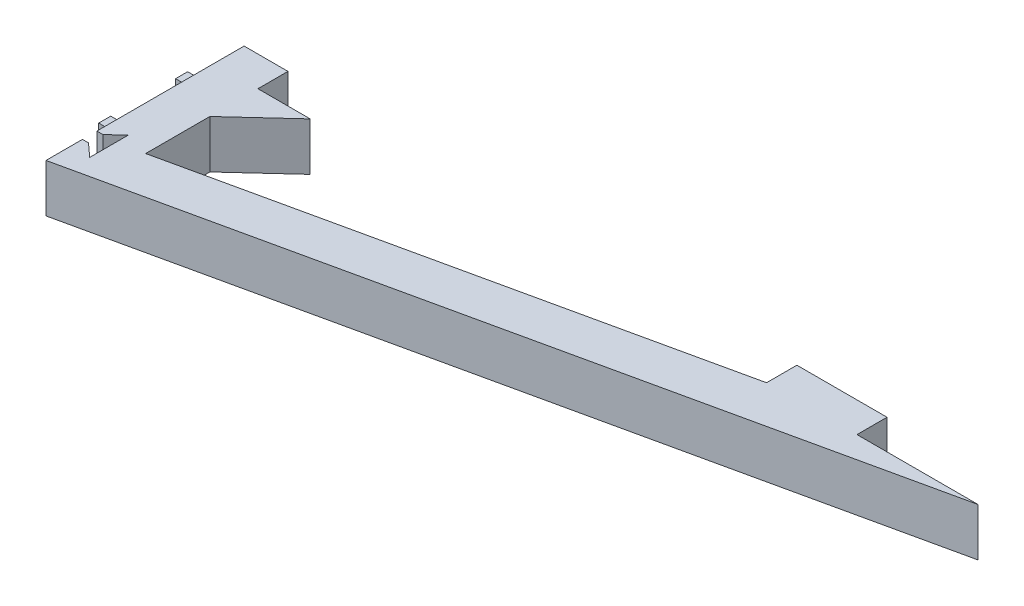
ISO-10303-21;
HEADER;
FILE_DESCRIPTION(('STEP AP214'),'2;1');
FILE_NAME('part.step','',(''),(''),'','','');
FILE_SCHEMA(('AUTOMOTIVE_DESIGN { 1 0 10303 214 1 1 1 1 }'));
ENDSEC;
DATA;
#1=APPLICATION_CONTEXT('core data for automotive mechanical design processes');
#2=APPLICATION_PROTOCOL_DEFINITION('international standard','automotive_design',2000,#1);
#3=PRODUCT_CONTEXT('',#1,'mechanical');
#4=PRODUCT('Part','Part','',(#3));
#5=PRODUCT_RELATED_PRODUCT_CATEGORY('part','',(#4));
#6=PRODUCT_DEFINITION_FORMATION('','',#4);
#7=PRODUCT_DEFINITION_CONTEXT('part definition',#1,'design');
#8=PRODUCT_DEFINITION('design','',#6,#7);
#9=PRODUCT_DEFINITION_SHAPE('','',#8);
#10=(LENGTH_UNIT() NAMED_UNIT(*) SI_UNIT(.MILLI.,.METRE.));
#11=(NAMED_UNIT(*) PLANE_ANGLE_UNIT() SI_UNIT($,.RADIAN.));
#12=(NAMED_UNIT(*) SI_UNIT($,.STERADIAN.) SOLID_ANGLE_UNIT());
#13=UNCERTAINTY_MEASURE_WITH_UNIT(LENGTH_MEASURE(1.E-05),#10,'distance_accuracy_value','');
#14=(GEOMETRIC_REPRESENTATION_CONTEXT(3) GLOBAL_UNCERTAINTY_ASSIGNED_CONTEXT((#13)) GLOBAL_UNIT_ASSIGNED_CONTEXT((#10,
#11,#12)) REPRESENTATION_CONTEXT('',''));
#15=CARTESIAN_POINT('',(0.,0.,0.));
#16=DIRECTION('',(0.,0.,1.));
#17=DIRECTION('',(1.,0.,0.));
#18=AXIS2_PLACEMENT_3D('',#15,#16,#17);
#19=CARTESIAN_POINT('',(7.3,8.,23.6847128039991));
#20=DIRECTION('',(-1.,0.,0.));
#21=DIRECTION('',(0.,0.,1.));
#22=AXIS2_PLACEMENT_3D('',#19,#20,#21);
#23=PLANE('',#22);
#24=DIRECTION('',(0.,0.,-1.));
#25=VECTOR('',#24,1.);
#26=CARTESIAN_POINT('',(7.3,8.,23.6847128039991));
#27=LINE('',#26,#25);
#28=CARTESIAN_POINT('',(7.3,8.,5.));
#29=VERTEX_POINT('',#28);
#30=CARTESIAN_POINT('',(7.3,8.,0.));
#31=VERTEX_POINT('',#30);
#32=EDGE_CURVE('E357',#29,#31,#27,.T.);
#33=ORIENTED_EDGE('',*,*,#32,.F.);
#34=DIRECTION('',(0.,-1.,0.));
#35=VECTOR('',#34,1.);
#36=CARTESIAN_POINT('',(7.3,8.,5.));
#37=LINE('',#36,#35);
#38=CARTESIAN_POINT('',(7.3,0.,5.));
#39=VERTEX_POINT('',#38);
#40=EDGE_CURVE('E223',#29,#39,#37,.T.);
#41=ORIENTED_EDGE('',*,*,#40,.T.);
#42=DIRECTION('',(0.,0.,-1.));
#43=VECTOR('',#42,1.);
#44=CARTESIAN_POINT('',(7.3,0.,23.6847128039991));
#45=LINE('',#44,#43);
#46=CARTESIAN_POINT('',(7.3,0.,0.));
#47=VERTEX_POINT('',#46);
#48=EDGE_CURVE('E377',#39,#47,#45,.T.);
#49=ORIENTED_EDGE('',*,*,#48,.T.);
#50=DIRECTION('',(0.,-1.,0.));
#51=VECTOR('',#50,1.);
#52=CARTESIAN_POINT('',(7.3,8.,0.));
#53=LINE('',#52,#51);
#54=EDGE_CURVE('E359',#31,#47,#53,.T.);
#55=ORIENTED_EDGE('',*,*,#54,.F.);
#56=EDGE_LOOP('',(#33,#41,#49,#55));
#57=FACE_BOUND('',#56,.T.);
#58=ADVANCED_FACE('F32',(#57),#23,.F.);
#59=CARTESIAN_POINT('',(0.,8.,0.));
#60=DIRECTION('',(1.,0.,0.));
#61=DIRECTION('',(0.,0.,-1.));
#62=AXIS2_PLACEMENT_3D('',#59,#60,#61);
#63=PLANE('',#62);
#64=DIRECTION('',(0.,1.,0.));
#65=VECTOR('',#64,1.);
#66=CARTESIAN_POINT('',(0.,0.,24.5));
#67=LINE('',#66,#65);
#68=CARTESIAN_POINT('',(0.,0.,24.5));
#69=VERTEX_POINT('',#68);
#70=CARTESIAN_POINT('',(0.,8.,24.5));
#71=VERTEX_POINT('',#70);
#72=EDGE_CURVE('E325',#69,#71,#67,.T.);
#73=ORIENTED_EDGE('',*,*,#72,.T.);
#74=DIRECTION('',(0.,0.,1.));
#75=VECTOR('',#74,1.);
#76=CARTESIAN_POINT('',(0.,8.,0.));
#77=LINE('',#76,#75);
#78=CARTESIAN_POINT('',(0.,8.,0.));
#79=VERTEX_POINT('',#78);
#80=EDGE_CURVE('E343',#79,#71,#77,.T.);
#81=ORIENTED_EDGE('',*,*,#80,.F.);
#82=DIRECTION('',(0.,-1.,0.));
#83=VECTOR('',#82,1.);
#84=CARTESIAN_POINT('',(0.,8.,0.));
#85=LINE('',#84,#83);
#86=CARTESIAN_POINT('',(0.,0.,0.));
#87=VERTEX_POINT('',#86);
#88=EDGE_CURVE('E11',#79,#87,#85,.T.);
#89=ORIENTED_EDGE('',*,*,#88,.T.);
#90=DIRECTION('',(0.,0.,1.));
#91=VECTOR('',#90,1.);
#92=CARTESIAN_POINT('',(0.,0.,0.));
#93=LINE('',#92,#91);
#94=EDGE_CURVE('E363',#87,#69,#93,.T.);
#95=ORIENTED_EDGE('',*,*,#94,.T.);
#96=EDGE_LOOP('',(#73,#81,#89,#95));
#97=FACE_BOUND('',#96,.T.);
#98=DIRECTION('',(0.,-1.,0.));
#99=VECTOR('',#98,1.);
#100=CARTESIAN_POINT('',(0.,5.,18.2));
#101=LINE('',#100,#99);
#102=CARTESIAN_POINT('',(0.,5.,18.2));
#103=VERTEX_POINT('',#102);
#104=CARTESIAN_POINT('',(0.,3.,18.2));
#105=VERTEX_POINT('',#104);
#106=EDGE_CURVE('E231',#103,#105,#101,.T.);
#107=ORIENTED_EDGE('',*,*,#106,.F.);
#108=DIRECTION('',(0.,0.,-1.));
#109=VECTOR('',#108,1.);
#110=CARTESIAN_POINT('',(0.,5.,18.2));
#111=LINE('',#110,#109);
#112=CARTESIAN_POINT('',(0.,5.,20.2));
#113=VERTEX_POINT('',#112);
#114=EDGE_CURVE('E236',#113,#103,#111,.T.);
#115=ORIENTED_EDGE('',*,*,#114,.F.);
#116=DIRECTION('',(0.,1.,0.));
#117=VECTOR('',#116,1.);
#118=CARTESIAN_POINT('',(0.,5.,20.2));
#119=LINE('',#118,#117);
#120=CARTESIAN_POINT('',(0.,3.,20.2));
#121=VERTEX_POINT('',#120);
#122=EDGE_CURVE('E246',#121,#113,#119,.T.);
#123=ORIENTED_EDGE('',*,*,#122,.F.);
#124=DIRECTION('',(0.,0.,1.));
#125=VECTOR('',#124,1.);
#126=CARTESIAN_POINT('',(0.,3.,18.2));
#127=LINE('',#126,#125);
#128=EDGE_CURVE('E55',#105,#121,#127,.T.);
#129=ORIENTED_EDGE('',*,*,#128,.F.);
#130=EDGE_LOOP('',(#107,#115,#123,#129));
#131=FACE_BOUND('',#130,.T.);
#132=DIRECTION('',(0.,-1.,0.));
#133=VECTOR('',#132,1.);
#134=CARTESIAN_POINT('',(0.,5.,5.4));
#135=LINE('',#134,#133);
#136=CARTESIAN_POINT('',(0.,5.,5.4));
#137=VERTEX_POINT('',#136);
#138=CARTESIAN_POINT('',(0.,3.,5.4));
#139=VERTEX_POINT('',#138);
#140=EDGE_CURVE('E261',#137,#139,#135,.T.);
#141=ORIENTED_EDGE('',*,*,#140,.F.);
#142=DIRECTION('',(0.,0.,-1.));
#143=VECTOR('',#142,1.);
#144=CARTESIAN_POINT('',(0.,5.,5.4));
#145=LINE('',#144,#143);
#146=CARTESIAN_POINT('',(0.,5.,7.4));
#147=VERTEX_POINT('',#146);
#148=EDGE_CURVE('E266',#147,#137,#145,.T.);
#149=ORIENTED_EDGE('',*,*,#148,.F.);
#150=DIRECTION('',(0.,1.,0.));
#151=VECTOR('',#150,1.);
#152=CARTESIAN_POINT('',(0.,5.,7.4));
#153=LINE('',#152,#151);
#154=CARTESIAN_POINT('',(0.,3.,7.4));
#155=VERTEX_POINT('',#154);
#156=EDGE_CURVE('E278',#155,#147,#153,.T.);
#157=ORIENTED_EDGE('',*,*,#156,.F.);
#158=DIRECTION('',(0.,0.,1.));
#159=VECTOR('',#158,1.);
#160=CARTESIAN_POINT('',(0.,3.,5.4));
#161=LINE('',#160,#159);
#162=EDGE_CURVE('E275',#139,#155,#161,.T.);
#163=ORIENTED_EDGE('',*,*,#162,.F.);
#164=EDGE_LOOP('',(#141,#149,#157,#163));
#165=FACE_BOUND('',#164,.T.);
#166=ADVANCED_FACE('F448',(#97,#131,#165),#63,.F.);
#167=CARTESIAN_POINT('',(7.3,8.,0.));
#168=DIRECTION('',(0.,0.,1.));
#169=DIRECTION('',(1.,0.,0.));
#170=AXIS2_PLACEMENT_3D('',#167,#168,#169);
#171=PLANE('',#170);
#172=DIRECTION('',(-1.,0.,0.));
#173=VECTOR('',#172,1.);
#174=CARTESIAN_POINT('',(7.3,0.,0.));
#175=LINE('',#174,#173);
#176=EDGE_CURVE('E328',#47,#87,#175,.T.);
#177=ORIENTED_EDGE('',*,*,#176,.T.);
#178=ORIENTED_EDGE('',*,*,#88,.F.);
#179=DIRECTION('',(-1.,0.,0.));
#180=VECTOR('',#179,1.);
#181=CARTESIAN_POINT('',(7.3,8.,0.));
#182=LINE('',#181,#180);
#183=EDGE_CURVE('E338',#31,#79,#182,.T.);
#184=ORIENTED_EDGE('',*,*,#183,.F.);
#185=ORIENTED_EDGE('',*,*,#54,.T.);
#186=EDGE_LOOP('',(#177,#178,#184,#185));
#187=FACE_BOUND('',#186,.T.);
#188=ADVANCED_FACE('F34',(#187),#171,.F.);
#189=CARTESIAN_POINT('',(0.,8.,26.9));
#190=VERTEX_POINT('',#189);
#191=CARTESIAN_POINT('',(0.,8.,32.97));
#192=VERTEX_POINT('',#191);
#193=EDGE_CURVE('E341',#190,#192,#77,.T.);
#194=ORIENTED_EDGE('',*,*,#193,.F.);
#195=DIRECTION('',(0.,1.,0.));
#196=VECTOR('',#195,1.);
#197=CARTESIAN_POINT('',(0.,0.,26.9));
#198=LINE('',#197,#196);
#199=CARTESIAN_POINT('',(0.,0.,26.9));
#200=VERTEX_POINT('',#199);
#201=EDGE_CURVE('E311',#200,#190,#198,.T.);
#202=ORIENTED_EDGE('',*,*,#201,.F.);
#203=CARTESIAN_POINT('',(0.,0.,32.97));
#204=VERTEX_POINT('',#203);
#205=EDGE_CURVE('E362',#200,#204,#93,.T.);
#206=ORIENTED_EDGE('',*,*,#205,.T.);
#207=DIRECTION('',(0.,-1.,0.));
#208=VECTOR('',#207,1.);
#209=CARTESIAN_POINT('',(0.,8.,32.97));
#210=LINE('',#209,#208);
#211=EDGE_CURVE('E40',#192,#204,#210,.T.);
#212=ORIENTED_EDGE('',*,*,#211,.F.);
#213=EDGE_LOOP('',(#194,#202,#206,#212));
#214=FACE_BOUND('',#213,.T.);
#215=ADVANCED_FACE('F427',(#214),#63,.F.);
#216=CARTESIAN_POINT('',(0.,8.,32.97));
#217=DIRECTION('',(-0.214854648592963,0.,-0.976646036175847));
#218=DIRECTION('',(-0.976646036175847,0.,0.214854648592963));
#219=AXIS2_PLACEMENT_3D('',#216,#217,#218);
#220=PLANE('',#219);
#221=DIRECTION('',(0.976646036175847,0.,-0.214854648592963));
#222=VECTOR('',#221,1.);
#223=CARTESIAN_POINT('',(0.,0.,32.97));
#224=LINE('',#223,#222);
#225=CARTESIAN_POINT('',(127.140789416148,0.,5.));
#226=VERTEX_POINT('',#225);
#227=EDGE_CURVE('E365',#204,#226,#224,.T.);
#228=ORIENTED_EDGE('',*,*,#227,.T.);
#229=DIRECTION('',(0.,-1.,0.));
#230=VECTOR('',#229,1.);
#231=CARTESIAN_POINT('',(127.140789416148,8.,5.));
#232=LINE('',#231,#230);
#233=CARTESIAN_POINT('',(127.140789416148,8.,5.));
#234=VERTEX_POINT('',#233);
#235=EDGE_CURVE('E397',#234,#226,#232,.T.);
#236=ORIENTED_EDGE('',*,*,#235,.F.);
#237=DIRECTION('',(0.976646036175847,0.,-0.214854648592963));
#238=VECTOR('',#237,1.);
#239=CARTESIAN_POINT('',(0.,8.,32.97));
#240=LINE('',#239,#238);
#241=EDGE_CURVE('E345',#192,#234,#240,.T.);
#242=ORIENTED_EDGE('',*,*,#241,.F.);
#243=ORIENTED_EDGE('',*,*,#211,.T.);
#244=EDGE_LOOP('',(#228,#236,#242,#243));
#245=FACE_BOUND('',#244,.T.);
#246=ADVANCED_FACE('F404',(#245),#220,.F.);
#247=CARTESIAN_POINT('',(127.140789416148,8.,5.));
#248=DIRECTION('',(0.,0.,1.));
#249=DIRECTION('',(1.,0.,0.));
#250=AXIS2_PLACEMENT_3D('',#247,#248,#249);
#251=PLANE('',#250);
#252=DIRECTION('',(-1.,0.,0.));
#253=VECTOR('',#252,1.);
#254=CARTESIAN_POINT('',(127.140789416148,0.,5.));
#255=LINE('',#254,#253);
#256=CARTESIAN_POINT('',(107.,0.,5.));
#257=VERTEX_POINT('',#256);
#258=EDGE_CURVE('E367',#226,#257,#255,.T.);
#259=ORIENTED_EDGE('',*,*,#258,.T.);
#260=DIRECTION('',(0.,-1.,0.));
#261=VECTOR('',#260,1.);
#262=CARTESIAN_POINT('',(107.,8.,5.));
#263=LINE('',#262,#261);
#264=CARTESIAN_POINT('',(107.,8.,5.));
#265=VERTEX_POINT('',#264);
#266=EDGE_CURVE('E394',#265,#257,#263,.T.);
#267=ORIENTED_EDGE('',*,*,#266,.F.);
#268=DIRECTION('',(-1.,0.,0.));
#269=VECTOR('',#268,1.);
#270=CARTESIAN_POINT('',(127.140789416148,8.,5.));
#271=LINE('',#270,#269);
#272=EDGE_CURVE('E347',#234,#265,#271,.T.);
#273=ORIENTED_EDGE('',*,*,#272,.F.);
#274=ORIENTED_EDGE('',*,*,#235,.T.);
#275=EDGE_LOOP('',(#259,#267,#273,#274));
#276=FACE_BOUND('',#275,.T.);
#277=ADVANCED_FACE('F416',(#276),#251,.F.);
#278=CARTESIAN_POINT('',(107.,8.,5.));
#279=DIRECTION('',(-1.,0.,0.));
#280=DIRECTION('',(0.,0.,1.));
#281=AXIS2_PLACEMENT_3D('',#278,#279,#280);
#282=PLANE('',#281);
#283=DIRECTION('',(0.,0.,-1.));
#284=VECTOR('',#283,1.);
#285=CARTESIAN_POINT('',(107.,0.,5.));
#286=LINE('',#285,#284);
#287=CARTESIAN_POINT('',(107.,0.,0.));
#288=VERTEX_POINT('',#287);
#289=EDGE_CURVE('E369',#257,#288,#286,.T.);
#290=ORIENTED_EDGE('',*,*,#289,.T.);
#291=DIRECTION('',(0.,-1.,0.));
#292=VECTOR('',#291,1.);
#293=CARTESIAN_POINT('',(107.,8.,0.));
#294=LINE('',#293,#292);
#295=CARTESIAN_POINT('',(107.,8.,0.));
#296=VERTEX_POINT('',#295);
#297=EDGE_CURVE('E391',#296,#288,#294,.T.);
#298=ORIENTED_EDGE('',*,*,#297,.F.);
#299=DIRECTION('',(0.,0.,-1.));
#300=VECTOR('',#299,1.);
#301=CARTESIAN_POINT('',(107.,8.,5.));
#302=LINE('',#301,#300);
#303=EDGE_CURVE('E349',#265,#296,#302,.T.);
#304=ORIENTED_EDGE('',*,*,#303,.F.);
#305=ORIENTED_EDGE('',*,*,#266,.T.);
#306=EDGE_LOOP('',(#290,#298,#304,#305));
#307=FACE_BOUND('',#306,.T.);
#308=ADVANCED_FACE('F420',(#307),#282,.F.);
#309=CARTESIAN_POINT('',(107.,8.,0.));
#310=DIRECTION('',(0.,0.,1.));
#311=DIRECTION('',(1.,0.,0.));
#312=AXIS2_PLACEMENT_3D('',#309,#310,#311);
#313=PLANE('',#312);
#314=DIRECTION('',(-1.,0.,0.));
#315=VECTOR('',#314,1.);
#316=CARTESIAN_POINT('',(107.,0.,0.));
#317=LINE('',#316,#315);
#318=CARTESIAN_POINT('',(92.,0.,0.));
#319=VERTEX_POINT('',#318);
#320=EDGE_CURVE('E371',#288,#319,#317,.T.);
#321=ORIENTED_EDGE('',*,*,#320,.T.);
#322=DIRECTION('',(0.,-1.,0.));
#323=VECTOR('',#322,1.);
#324=CARTESIAN_POINT('',(92.,8.,0.));
#325=LINE('',#324,#323);
#326=CARTESIAN_POINT('',(92.,8.,0.));
#327=VERTEX_POINT('',#326);
#328=EDGE_CURVE('E388',#327,#319,#325,.T.);
#329=ORIENTED_EDGE('',*,*,#328,.F.);
#330=DIRECTION('',(-1.,0.,0.));
#331=VECTOR('',#330,1.);
#332=CARTESIAN_POINT('',(107.,8.,0.));
#333=LINE('',#332,#331);
#334=EDGE_CURVE('E351',#296,#327,#333,.T.);
#335=ORIENTED_EDGE('',*,*,#334,.F.);
#336=ORIENTED_EDGE('',*,*,#297,.T.);
#337=EDGE_LOOP('',(#321,#329,#335,#336));
#338=FACE_BOUND('',#337,.T.);
#339=ADVANCED_FACE('F482',(#338),#313,.F.);
#340=CARTESIAN_POINT('',(92.,8.,0.));
#341=DIRECTION('',(1.,0.,0.));
#342=DIRECTION('',(0.,0.,-1.));
#343=AXIS2_PLACEMENT_3D('',#340,#341,#342);
#344=PLANE('',#343);
#345=DIRECTION('',(0.,0.,1.));
#346=VECTOR('',#345,1.);
#347=CARTESIAN_POINT('',(92.,0.,0.));
#348=LINE('',#347,#346);
#349=CARTESIAN_POINT('',(92.,0.,5.05136145484425));
#350=VERTEX_POINT('',#349);
#351=EDGE_CURVE('E373',#319,#350,#348,.T.);
#352=ORIENTED_EDGE('',*,*,#351,.T.);
#353=DIRECTION('',(0.,-1.,0.));
#354=VECTOR('',#353,1.);
#355=CARTESIAN_POINT('',(92.,8.,5.05136145484425));
#356=LINE('',#355,#354);
#357=CARTESIAN_POINT('',(92.,8.,5.05136145484425));
#358=VERTEX_POINT('',#357);
#359=EDGE_CURVE('E385',#358,#350,#356,.T.);
#360=ORIENTED_EDGE('',*,*,#359,.F.);
#361=DIRECTION('',(0.,0.,1.));
#362=VECTOR('',#361,1.);
#363=CARTESIAN_POINT('',(92.,8.,0.));
#364=LINE('',#363,#362);
#365=EDGE_CURVE('E353',#327,#358,#364,.T.);
#366=ORIENTED_EDGE('',*,*,#365,.F.);
#367=ORIENTED_EDGE('',*,*,#328,.T.);
#368=EDGE_LOOP('',(#352,#360,#366,#367));
#369=FACE_BOUND('',#368,.T.);
#370=ADVANCED_FACE('F471',(#369),#344,.F.);
#371=CARTESIAN_POINT('',(92.,8.,5.05136145484425));
#372=DIRECTION('',(0.214854648592963,0.,0.976646036175847));
#373=DIRECTION('',(0.976646036175847,0.,-0.214854648592963));
#374=AXIS2_PLACEMENT_3D('',#371,#372,#373);
#375=PLANE('',#374);
#376=DIRECTION('',(-0.976646036175847,0.,0.214854648592963));
#377=VECTOR('',#376,1.);
#378=CARTESIAN_POINT('',(92.,0.,5.05136145484425));
#379=LINE('',#378,#377);
#380=CARTESIAN_POINT('',(7.3,0.,23.6847128039991));
#381=VERTEX_POINT('',#380);
#382=EDGE_CURVE('E375',#350,#381,#379,.T.);
#383=ORIENTED_EDGE('',*,*,#382,.T.);
#384=DIRECTION('',(0.,-1.,0.));
#385=VECTOR('',#384,1.);
#386=CARTESIAN_POINT('',(7.3,8.,23.6847128039991));
#387=LINE('',#386,#385);
#388=CARTESIAN_POINT('',(7.3,8.,23.6847128039991));
#389=VERTEX_POINT('',#388);
#390=EDGE_CURVE('E382',#389,#381,#387,.T.);
#391=ORIENTED_EDGE('',*,*,#390,.F.);
#392=DIRECTION('',(-0.976646036175847,0.,0.214854648592963));
#393=VECTOR('',#392,1.);
#394=CARTESIAN_POINT('',(92.,8.,5.05136145484425));
#395=LINE('',#394,#393);
#396=EDGE_CURVE('E355',#358,#389,#395,.T.);
#397=ORIENTED_EDGE('',*,*,#396,.F.);
#398=ORIENTED_EDGE('',*,*,#359,.T.);
#399=EDGE_LOOP('',(#383,#391,#397,#398));
#400=FACE_BOUND('',#399,.T.);
#401=ADVANCED_FACE('F464',(#400),#375,.F.);
#402=CARTESIAN_POINT('',(7.3,0.,13.));
#403=VERTEX_POINT('',#402);
#404=EDGE_CURVE('E342',#381,#403,#45,.T.);
#405=ORIENTED_EDGE('',*,*,#404,.T.);
#406=DIRECTION('',(0.,1.,0.));
#407=VECTOR('',#406,1.);
#408=CARTESIAN_POINT('',(7.3,8.,13.));
#409=LINE('',#408,#407);
#410=CARTESIAN_POINT('',(7.3,8.,13.));
#411=VERTEX_POINT('',#410);
#412=EDGE_CURVE('E213',#403,#411,#409,.T.);
#413=ORIENTED_EDGE('',*,*,#412,.T.);
#414=EDGE_CURVE('E219',#389,#411,#27,.T.);
#415=ORIENTED_EDGE('',*,*,#414,.F.);
#416=ORIENTED_EDGE('',*,*,#390,.T.);
#417=EDGE_LOOP('',(#405,#413,#415,#416));
#418=FACE_BOUND('',#417,.T.);
#419=ADVANCED_FACE('F457',(#418),#23,.F.);
#420=CARTESIAN_POINT('',(0.,8.,0.));
#421=DIRECTION('',(0.,1.,0.));
#422=DIRECTION('',(0.,0.,1.));
#423=AXIS2_PLACEMENT_3D('',#420,#421,#422);
#424=PLANE('',#423);
#425=DIRECTION('',(0.736099620693866,0.,-0.676873214431141));
#426=VECTOR('',#425,1.);
#427=CARTESIAN_POINT('',(16.,8.,5.));
#428=LINE('',#427,#426);
#429=CARTESIAN_POINT('',(16.,8.,5.));
#430=VERTEX_POINT('',#429);
#431=EDGE_CURVE('E207',#411,#430,#428,.T.);
#432=ORIENTED_EDGE('',*,*,#431,.T.);
#433=DIRECTION('',(-1.,0.,0.));
#434=VECTOR('',#433,1.);
#435=CARTESIAN_POINT('',(0.,8.,5.));
#436=LINE('',#435,#434);
#437=EDGE_CURVE('E47',#430,#29,#436,.T.);
#438=ORIENTED_EDGE('',*,*,#437,.T.);
#439=ORIENTED_EDGE('',*,*,#32,.T.);
#440=ORIENTED_EDGE('',*,*,#183,.T.);
#441=ORIENTED_EDGE('',*,*,#80,.T.);
#442=DIRECTION('',(-1.,0.,0.));
#443=VECTOR('',#442,1.);
#444=CARTESIAN_POINT('',(0.,8.,24.5));
#445=LINE('',#444,#443);
#446=CARTESIAN_POINT('',(1.,8.,24.5));
#447=VERTEX_POINT('',#446);
#448=EDGE_CURVE('E299',#447,#71,#445,.T.);
#449=ORIENTED_EDGE('',*,*,#448,.F.);
#450=DIRECTION('',(-0.739940073395943,0.,0.672672793996313));
#451=VECTOR('',#450,1.);
#452=CARTESIAN_POINT('',(1.,8.,24.5));
#453=LINE('',#452,#451);
#454=CARTESIAN_POINT('',(3.2,8.,22.5));
#455=VERTEX_POINT('',#454);
#456=EDGE_CURVE('E320',#455,#447,#453,.T.);
#457=ORIENTED_EDGE('',*,*,#456,.F.);
#458=DIRECTION('',(0.,0.,-1.));
#459=VECTOR('',#458,1.);
#460=CARTESIAN_POINT('',(3.2,8.,22.5));
#461=LINE('',#460,#459);
#462=CARTESIAN_POINT('',(3.2,8.,28.9));
#463=VERTEX_POINT('',#462);
#464=EDGE_CURVE('E317',#463,#455,#461,.T.);
#465=ORIENTED_EDGE('',*,*,#464,.F.);
#466=DIRECTION('',(0.739940073395944,0.,0.672672793996312));
#467=VECTOR('',#466,1.);
#468=CARTESIAN_POINT('',(3.2,8.,28.9));
#469=LINE('',#468,#467);
#470=CARTESIAN_POINT('',(1.,8.,26.9));
#471=VERTEX_POINT('',#470);
#472=EDGE_CURVE('E314',#471,#463,#469,.T.);
#473=ORIENTED_EDGE('',*,*,#472,.F.);
#474=DIRECTION('',(1.,0.,0.));
#475=VECTOR('',#474,1.);
#476=CARTESIAN_POINT('',(1.,8.,26.9));
#477=LINE('',#476,#475);
#478=EDGE_CURVE('E294',#190,#471,#477,.T.);
#479=ORIENTED_EDGE('',*,*,#478,.F.);
#480=ORIENTED_EDGE('',*,*,#193,.T.);
#481=ORIENTED_EDGE('',*,*,#241,.T.);
#482=ORIENTED_EDGE('',*,*,#272,.T.);
#483=ORIENTED_EDGE('',*,*,#303,.T.);
#484=ORIENTED_EDGE('',*,*,#334,.T.);
#485=ORIENTED_EDGE('',*,*,#365,.T.);
#486=ORIENTED_EDGE('',*,*,#396,.T.);
#487=ORIENTED_EDGE('',*,*,#414,.T.);
#488=EDGE_LOOP('',(#432,#438,#439,#440,#441,#449,#457,#465,#473,#479,#480,#481,#482,#483,#484,
#485,#486,#487));
#489=FACE_BOUND('',#488,.T.);
#490=ADVANCED_FACE('F217',(#489),#424,.T.);
#491=CARTESIAN_POINT('',(0.,0.,0.));
#492=DIRECTION('',(0.,1.,0.));
#493=DIRECTION('',(0.,0.,1.));
#494=AXIS2_PLACEMENT_3D('',#491,#492,#493);
#495=PLANE('',#494);
#496=DIRECTION('',(-1.,0.,0.));
#497=VECTOR('',#496,1.);
#498=CARTESIAN_POINT('',(0.,0.,5.));
#499=LINE('',#498,#497);
#500=CARTESIAN_POINT('',(16.,0.,5.));
#501=VERTEX_POINT('',#500);
#502=EDGE_CURVE('E214',#501,#39,#499,.T.);
#503=ORIENTED_EDGE('',*,*,#502,.F.);
#504=DIRECTION('',(0.736099620693866,0.,-0.676873214431141));
#505=VECTOR('',#504,1.);
#506=CARTESIAN_POINT('',(16.,0.,5.));
#507=LINE('',#506,#505);
#508=EDGE_CURVE('E210',#403,#501,#507,.T.);
#509=ORIENTED_EDGE('',*,*,#508,.F.);
#510=ORIENTED_EDGE('',*,*,#404,.F.);
#511=ORIENTED_EDGE('',*,*,#382,.F.);
#512=ORIENTED_EDGE('',*,*,#351,.F.);
#513=ORIENTED_EDGE('',*,*,#320,.F.);
#514=ORIENTED_EDGE('',*,*,#289,.F.);
#515=ORIENTED_EDGE('',*,*,#258,.F.);
#516=ORIENTED_EDGE('',*,*,#227,.F.);
#517=ORIENTED_EDGE('',*,*,#205,.F.);
#518=DIRECTION('',(1.,0.,0.));
#519=VECTOR('',#518,1.);
#520=CARTESIAN_POINT('',(1.,0.,26.9));
#521=LINE('',#520,#519);
#522=CARTESIAN_POINT('',(1.,0.,26.9));
#523=VERTEX_POINT('',#522);
#524=EDGE_CURVE('E295',#200,#523,#521,.T.);
#525=ORIENTED_EDGE('',*,*,#524,.T.);
#526=DIRECTION('',(0.739940073395944,0.,0.672672793996312));
#527=VECTOR('',#526,1.);
#528=CARTESIAN_POINT('',(3.2,0.,28.9));
#529=LINE('',#528,#527);
#530=CARTESIAN_POINT('',(3.2,0.,28.9));
#531=VERTEX_POINT('',#530);
#532=EDGE_CURVE('E298',#523,#531,#529,.T.);
#533=ORIENTED_EDGE('',*,*,#532,.T.);
#534=DIRECTION('',(0.,0.,-1.));
#535=VECTOR('',#534,1.);
#536=CARTESIAN_POINT('',(3.2,0.,22.5));
#537=LINE('',#536,#535);
#538=CARTESIAN_POINT('',(3.2,0.,22.5));
#539=VERTEX_POINT('',#538);
#540=EDGE_CURVE('E302',#531,#539,#537,.T.);
#541=ORIENTED_EDGE('',*,*,#540,.T.);
#542=DIRECTION('',(-0.739940073395943,0.,0.672672793996313));
#543=VECTOR('',#542,1.);
#544=CARTESIAN_POINT('',(1.,0.,24.5));
#545=LINE('',#544,#543);
#546=CARTESIAN_POINT('',(1.,0.,24.5));
#547=VERTEX_POINT('',#546);
#548=EDGE_CURVE('E305',#539,#547,#545,.T.);
#549=ORIENTED_EDGE('',*,*,#548,.T.);
#550=DIRECTION('',(-1.,0.,0.));
#551=VECTOR('',#550,1.);
#552=CARTESIAN_POINT('',(0.,0.,24.5));
#553=LINE('',#552,#551);
#554=EDGE_CURVE('E308',#547,#69,#553,.T.);
#555=ORIENTED_EDGE('',*,*,#554,.T.);
#556=ORIENTED_EDGE('',*,*,#94,.F.);
#557=ORIENTED_EDGE('',*,*,#176,.F.);
#558=ORIENTED_EDGE('',*,*,#48,.F.);
#559=EDGE_LOOP('',(#503,#509,#510,#511,#512,#513,#514,#515,#516,#517,#525,#533,#541,#549,#555,
#556,#557,#558));
#560=FACE_BOUND('',#559,.T.);
#561=ADVANCED_FACE('F411',(#560),#495,.F.);
#562=CARTESIAN_POINT('',(0.,0.,24.5));
#563=DIRECTION('',(0.,0.,-1.));
#564=DIRECTION('',(-1.,0.,0.));
#565=AXIS2_PLACEMENT_3D('',#562,#563,#564);
#566=PLANE('',#565);
#567=ORIENTED_EDGE('',*,*,#448,.T.);
#568=ORIENTED_EDGE('',*,*,#72,.F.);
#569=ORIENTED_EDGE('',*,*,#554,.F.);
#570=DIRECTION('',(0.,1.,0.));
#571=VECTOR('',#570,1.);
#572=CARTESIAN_POINT('',(1.,0.,24.5));
#573=LINE('',#572,#571);
#574=EDGE_CURVE('E329',#547,#447,#573,.T.);
#575=ORIENTED_EDGE('',*,*,#574,.T.);
#576=EDGE_LOOP('',(#567,#568,#569,#575));
#577=FACE_BOUND('',#576,.T.);
#578=ADVANCED_FACE('F445',(#577),#566,.F.);
#579=CARTESIAN_POINT('',(1.,0.,24.5));
#580=DIRECTION('',(-0.672672793996313,0.,-0.739940073395944));
#581=DIRECTION('',(-0.739940073395944,0.,0.672672793996313));
#582=AXIS2_PLACEMENT_3D('',#579,#580,#581);
#583=PLANE('',#582);
#584=ORIENTED_EDGE('',*,*,#456,.T.);
#585=ORIENTED_EDGE('',*,*,#574,.F.);
#586=ORIENTED_EDGE('',*,*,#548,.F.);
#587=DIRECTION('',(0.,1.,0.));
#588=VECTOR('',#587,1.);
#589=CARTESIAN_POINT('',(3.2,0.,22.5));
#590=LINE('',#589,#588);
#591=EDGE_CURVE('E331',#539,#455,#590,.T.);
#592=ORIENTED_EDGE('',*,*,#591,.T.);
#593=EDGE_LOOP('',(#584,#585,#586,#592));
#594=FACE_BOUND('',#593,.T.);
#595=ADVANCED_FACE('F440',(#594),#583,.F.);
#596=CARTESIAN_POINT('',(3.2,0.,22.5));
#597=DIRECTION('',(1.,0.,0.));
#598=DIRECTION('',(0.,0.,-1.));
#599=AXIS2_PLACEMENT_3D('',#596,#597,#598);
#600=PLANE('',#599);
#601=ORIENTED_EDGE('',*,*,#464,.T.);
#602=ORIENTED_EDGE('',*,*,#591,.F.);
#603=ORIENTED_EDGE('',*,*,#540,.F.);
#604=DIRECTION('',(0.,1.,0.));
#605=VECTOR('',#604,1.);
#606=CARTESIAN_POINT('',(3.2,0.,28.9));
#607=LINE('',#606,#605);
#608=EDGE_CURVE('E333',#531,#463,#607,.T.);
#609=ORIENTED_EDGE('',*,*,#608,.T.);
#610=EDGE_LOOP('',(#601,#602,#603,#609));
#611=FACE_BOUND('',#610,.T.);
#612=ADVANCED_FACE('F436',(#611),#600,.F.);
#613=CARTESIAN_POINT('',(3.2,0.,28.9));
#614=DIRECTION('',(-0.672672793996312,0.,0.739940073395944));
#615=DIRECTION('',(0.739940073395944,0.,0.672672793996312));
#616=AXIS2_PLACEMENT_3D('',#613,#614,#615);
#617=PLANE('',#616);
#618=ORIENTED_EDGE('',*,*,#472,.T.);
#619=ORIENTED_EDGE('',*,*,#608,.F.);
#620=ORIENTED_EDGE('',*,*,#532,.F.);
#621=DIRECTION('',(0.,1.,0.));
#622=VECTOR('',#621,1.);
#623=CARTESIAN_POINT('',(1.,0.,26.9));
#624=LINE('',#623,#622);
#625=EDGE_CURVE('E335',#523,#471,#624,.T.);
#626=ORIENTED_EDGE('',*,*,#625,.T.);
#627=EDGE_LOOP('',(#618,#619,#620,#626));
#628=FACE_BOUND('',#627,.T.);
#629=ADVANCED_FACE('F433',(#628),#617,.F.);
#630=CARTESIAN_POINT('',(1.,0.,26.9));
#631=DIRECTION('',(0.,0.,1.));
#632=DIRECTION('',(1.,0.,0.));
#633=AXIS2_PLACEMENT_3D('',#630,#631,#632);
#634=PLANE('',#633);
#635=ORIENTED_EDGE('',*,*,#478,.T.);
#636=ORIENTED_EDGE('',*,*,#625,.F.);
#637=ORIENTED_EDGE('',*,*,#524,.F.);
#638=ORIENTED_EDGE('',*,*,#201,.T.);
#639=EDGE_LOOP('',(#635,#636,#637,#638));
#640=FACE_BOUND('',#639,.T.);
#641=ADVANCED_FACE('F429',(#640),#634,.F.);
#642=CARTESIAN_POINT('',(-4.,5.,5.4));
#643=DIRECTION('',(0.,0.,1.));
#644=DIRECTION('',(1.,0.,0.));
#645=AXIS2_PLACEMENT_3D('',#642,#643,#644);
#646=PLANE('',#645);
#647=ORIENTED_EDGE('',*,*,#140,.T.);
#648=DIRECTION('',(1.,0.,0.));
#649=VECTOR('',#648,1.);
#650=CARTESIAN_POINT('',(-4.,3.,5.4));
#651=LINE('',#650,#649);
#652=CARTESIAN_POINT('',(-4.,3.,5.4));
#653=VERTEX_POINT('',#652);
#654=EDGE_CURVE('E291',#653,#139,#651,.T.);
#655=ORIENTED_EDGE('',*,*,#654,.F.);
#656=DIRECTION('',(0.,-1.,0.));
#657=VECTOR('',#656,1.);
#658=CARTESIAN_POINT('',(-4.,5.,5.4));
#659=LINE('',#658,#657);
#660=CARTESIAN_POINT('',(-4.,5.,5.4));
#661=VERTEX_POINT('',#660);
#662=EDGE_CURVE('E262',#661,#653,#659,.T.);
#663=ORIENTED_EDGE('',*,*,#662,.F.);
#664=DIRECTION('',(1.,0.,0.));
#665=VECTOR('',#664,1.);
#666=CARTESIAN_POINT('',(-4.,5.,5.4));
#667=LINE('',#666,#665);
#668=EDGE_CURVE('E272',#661,#137,#667,.T.);
#669=ORIENTED_EDGE('',*,*,#668,.T.);
#670=EDGE_LOOP('',(#647,#655,#663,#669));
#671=FACE_BOUND('',#670,.T.);
#672=ADVANCED_FACE('F588',(#671),#646,.F.);
#673=CARTESIAN_POINT('',(-4.,3.,5.4));
#674=DIRECTION('',(0.,1.,0.));
#675=DIRECTION('',(0.,0.,1.));
#676=AXIS2_PLACEMENT_3D('',#673,#674,#675);
#677=PLANE('',#676);
#678=ORIENTED_EDGE('',*,*,#162,.T.);
#679=DIRECTION('',(1.,0.,0.));
#680=VECTOR('',#679,1.);
#681=CARTESIAN_POINT('',(-4.,3.,7.4));
#682=LINE('',#681,#680);
#683=CARTESIAN_POINT('',(-4.,3.,7.4));
#684=VERTEX_POINT('',#683);
#685=EDGE_CURVE('E288',#684,#155,#682,.T.);
#686=ORIENTED_EDGE('',*,*,#685,.F.);
#687=DIRECTION('',(0.,0.,1.));
#688=VECTOR('',#687,1.);
#689=CARTESIAN_POINT('',(-4.,3.,5.4));
#690=LINE('',#689,#688);
#691=EDGE_CURVE('E265',#653,#684,#690,.T.);
#692=ORIENTED_EDGE('',*,*,#691,.F.);
#693=ORIENTED_EDGE('',*,*,#654,.T.);
#694=EDGE_LOOP('',(#678,#686,#692,#693));
#695=FACE_BOUND('',#694,.T.);
#696=ADVANCED_FACE('F584',(#695),#677,.F.);
#697=CARTESIAN_POINT('',(-4.,5.,7.4));
#698=DIRECTION('',(0.,0.,-1.));
#699=DIRECTION('',(-1.,0.,0.));
#700=AXIS2_PLACEMENT_3D('',#697,#698,#699);
#701=PLANE('',#700);
#702=ORIENTED_EDGE('',*,*,#156,.T.);
#703=DIRECTION('',(1.,0.,0.));
#704=VECTOR('',#703,1.);
#705=CARTESIAN_POINT('',(-4.,5.,7.4));
#706=LINE('',#705,#704);
#707=CARTESIAN_POINT('',(-4.,5.,7.4));
#708=VERTEX_POINT('',#707);
#709=EDGE_CURVE('E285',#708,#147,#706,.T.);
#710=ORIENTED_EDGE('',*,*,#709,.F.);
#711=DIRECTION('',(0.,1.,0.));
#712=VECTOR('',#711,1.);
#713=CARTESIAN_POINT('',(-4.,5.,7.4));
#714=LINE('',#713,#712);
#715=EDGE_CURVE('E268',#684,#708,#714,.T.);
#716=ORIENTED_EDGE('',*,*,#715,.F.);
#717=ORIENTED_EDGE('',*,*,#685,.T.);
#718=EDGE_LOOP('',(#702,#710,#716,#717));
#719=FACE_BOUND('',#718,.T.);
#720=ADVANCED_FACE('F580',(#719),#701,.F.);
#721=CARTESIAN_POINT('',(-4.,5.,5.4));
#722=DIRECTION('',(0.,-1.,0.));
#723=DIRECTION('',(0.,0.,-1.));
#724=AXIS2_PLACEMENT_3D('',#721,#722,#723);
#725=PLANE('',#724);
#726=ORIENTED_EDGE('',*,*,#148,.T.);
#727=ORIENTED_EDGE('',*,*,#668,.F.);
#728=DIRECTION('',(0.,0.,-1.));
#729=VECTOR('',#728,1.);
#730=CARTESIAN_POINT('',(-4.,5.,5.4));
#731=LINE('',#730,#729);
#732=EDGE_CURVE('E270',#708,#661,#731,.T.);
#733=ORIENTED_EDGE('',*,*,#732,.F.);
#734=ORIENTED_EDGE('',*,*,#709,.T.);
#735=EDGE_LOOP('',(#726,#727,#733,#734));
#736=FACE_BOUND('',#735,.T.);
#737=ADVANCED_FACE('F576',(#736),#725,.F.);
#738=CARTESIAN_POINT('',(-4.,0.,0.));
#739=DIRECTION('',(-1.,0.,0.));
#740=DIRECTION('',(0.,0.,1.));
#741=AXIS2_PLACEMENT_3D('',#738,#739,#740);
#742=PLANE('',#741);
#743=ORIENTED_EDGE('',*,*,#662,.T.);
#744=ORIENTED_EDGE('',*,*,#691,.T.);
#745=ORIENTED_EDGE('',*,*,#715,.T.);
#746=ORIENTED_EDGE('',*,*,#732,.T.);
#747=EDGE_LOOP('',(#743,#744,#745,#746));
#748=FACE_BOUND('',#747,.T.);
#749=ADVANCED_FACE('F572',(#748),#742,.T.);
#750=CARTESIAN_POINT('',(-4.,5.,18.2));
#751=DIRECTION('',(0.,0.,1.));
#752=DIRECTION('',(1.,0.,0.));
#753=AXIS2_PLACEMENT_3D('',#750,#751,#752);
#754=PLANE('',#753);
#755=ORIENTED_EDGE('',*,*,#106,.T.);
#756=DIRECTION('',(1.,0.,0.));
#757=VECTOR('',#756,1.);
#758=CARTESIAN_POINT('',(-4.,3.,18.2));
#759=LINE('',#758,#757);
#760=CARTESIAN_POINT('',(-4.,3.,18.2));
#761=VERTEX_POINT('',#760);
#762=EDGE_CURVE('E259',#761,#105,#759,.T.);
#763=ORIENTED_EDGE('',*,*,#762,.F.);
#764=DIRECTION('',(0.,-1.,0.));
#765=VECTOR('',#764,1.);
#766=CARTESIAN_POINT('',(-4.,5.,18.2));
#767=LINE('',#766,#765);
#768=CARTESIAN_POINT('',(-4.,5.,18.2));
#769=VERTEX_POINT('',#768);
#770=EDGE_CURVE('E232',#769,#761,#767,.T.);
#771=ORIENTED_EDGE('',*,*,#770,.F.);
#772=DIRECTION('',(1.,0.,0.));
#773=VECTOR('',#772,1.);
#774=CARTESIAN_POINT('',(-4.,5.,18.2));
#775=LINE('',#774,#773);
#776=EDGE_CURVE('E242',#769,#103,#775,.T.);
#777=ORIENTED_EDGE('',*,*,#776,.T.);
#778=EDGE_LOOP('',(#755,#763,#771,#777));
#779=FACE_BOUND('',#778,.T.);
#780=ADVANCED_FACE('F568',(#779),#754,.F.);
#781=CARTESIAN_POINT('',(-4.,3.,18.2));
#782=DIRECTION('',(0.,1.,0.));
#783=DIRECTION('',(0.,0.,1.));
#784=AXIS2_PLACEMENT_3D('',#781,#782,#783);
#785=PLANE('',#784);
#786=ORIENTED_EDGE('',*,*,#128,.T.);
#787=DIRECTION('',(1.,0.,0.));
#788=VECTOR('',#787,1.);
#789=CARTESIAN_POINT('',(-4.,3.,20.2));
#790=LINE('',#789,#788);
#791=CARTESIAN_POINT('',(-4.,3.,20.2));
#792=VERTEX_POINT('',#791);
#793=EDGE_CURVE('E256',#792,#121,#790,.T.);
#794=ORIENTED_EDGE('',*,*,#793,.F.);
#795=DIRECTION('',(0.,0.,1.));
#796=VECTOR('',#795,1.);
#797=CARTESIAN_POINT('',(-4.,3.,18.2));
#798=LINE('',#797,#796);
#799=EDGE_CURVE('E235',#761,#792,#798,.T.);
#800=ORIENTED_EDGE('',*,*,#799,.F.);
#801=ORIENTED_EDGE('',*,*,#762,.T.);
#802=EDGE_LOOP('',(#786,#794,#800,#801));
#803=FACE_BOUND('',#802,.T.);
#804=ADVANCED_FACE('F564',(#803),#785,.F.);
#805=CARTESIAN_POINT('',(-4.,5.,20.2));
#806=DIRECTION('',(0.,0.,-1.));
#807=DIRECTION('',(-1.,0.,0.));
#808=AXIS2_PLACEMENT_3D('',#805,#806,#807);
#809=PLANE('',#808);
#810=ORIENTED_EDGE('',*,*,#122,.T.);
#811=DIRECTION('',(1.,0.,0.));
#812=VECTOR('',#811,1.);
#813=CARTESIAN_POINT('',(-4.,5.,20.2));
#814=LINE('',#813,#812);
#815=CARTESIAN_POINT('',(-4.,5.,20.2));
#816=VERTEX_POINT('',#815);
#817=EDGE_CURVE('E253',#816,#113,#814,.T.);
#818=ORIENTED_EDGE('',*,*,#817,.F.);
#819=DIRECTION('',(0.,1.,0.));
#820=VECTOR('',#819,1.);
#821=CARTESIAN_POINT('',(-4.,5.,20.2));
#822=LINE('',#821,#820);
#823=EDGE_CURVE('E238',#792,#816,#822,.T.);
#824=ORIENTED_EDGE('',*,*,#823,.F.);
#825=ORIENTED_EDGE('',*,*,#793,.T.);
#826=EDGE_LOOP('',(#810,#818,#824,#825));
#827=FACE_BOUND('',#826,.T.);
#828=ADVANCED_FACE('F560',(#827),#809,.F.);
#829=CARTESIAN_POINT('',(-4.,5.,18.2));
#830=DIRECTION('',(0.,-1.,0.));
#831=DIRECTION('',(0.,0.,-1.));
#832=AXIS2_PLACEMENT_3D('',#829,#830,#831);
#833=PLANE('',#832);
#834=ORIENTED_EDGE('',*,*,#114,.T.);
#835=ORIENTED_EDGE('',*,*,#776,.F.);
#836=DIRECTION('',(0.,0.,-1.));
#837=VECTOR('',#836,1.);
#838=CARTESIAN_POINT('',(-4.,5.,18.2));
#839=LINE('',#838,#837);
#840=EDGE_CURVE('E240',#816,#769,#839,.T.);
#841=ORIENTED_EDGE('',*,*,#840,.F.);
#842=ORIENTED_EDGE('',*,*,#817,.T.);
#843=EDGE_LOOP('',(#834,#835,#841,#842));
#844=FACE_BOUND('',#843,.T.);
#845=ADVANCED_FACE('F556',(#844),#833,.F.);
#846=CARTESIAN_POINT('',(-4.,0.,0.));
#847=DIRECTION('',(-1.,0.,0.));
#848=DIRECTION('',(0.,0.,1.));
#849=AXIS2_PLACEMENT_3D('',#846,#847,#848);
#850=PLANE('',#849);
#851=ORIENTED_EDGE('',*,*,#770,.T.);
#852=ORIENTED_EDGE('',*,*,#799,.T.);
#853=ORIENTED_EDGE('',*,*,#823,.T.);
#854=ORIENTED_EDGE('',*,*,#840,.T.);
#855=EDGE_LOOP('',(#851,#852,#853,#854));
#856=FACE_BOUND('',#855,.T.);
#857=ADVANCED_FACE('F541',(#856),#850,.T.);
#858=CARTESIAN_POINT('',(0.,0.,5.));
#859=DIRECTION('',(0.,0.,-1.));
#860=DIRECTION('',(-1.,0.,0.));
#861=AXIS2_PLACEMENT_3D('',#858,#859,#860);
#862=PLANE('',#861);
#863=ORIENTED_EDGE('',*,*,#40,.F.);
#864=ORIENTED_EDGE('',*,*,#437,.F.);
#865=DIRECTION('',(0.,1.,0.));
#866=VECTOR('',#865,1.);
#867=CARTESIAN_POINT('',(16.,0.,5.));
#868=LINE('',#867,#866);
#869=EDGE_CURVE('E205',#501,#430,#868,.T.);
#870=ORIENTED_EDGE('',*,*,#869,.F.);
#871=ORIENTED_EDGE('',*,*,#502,.T.);
#872=EDGE_LOOP('',(#863,#864,#870,#871));
#873=FACE_BOUND('',#872,.T.);
#874=ADVANCED_FACE('F221',(#873),#862,.T.);
#875=CARTESIAN_POINT('',(16.,8.,5.));
#876=DIRECTION('',(-0.676873214431141,0.,-0.736099620693866));
#877=DIRECTION('',(-0.736099620693866,0.,0.676873214431141));
#878=AXIS2_PLACEMENT_3D('',#875,#876,#877);
#879=PLANE('',#878);
#880=ORIENTED_EDGE('',*,*,#508,.T.);
#881=ORIENTED_EDGE('',*,*,#869,.T.);
#882=ORIENTED_EDGE('',*,*,#431,.F.);
#883=ORIENTED_EDGE('',*,*,#412,.F.);
#884=EDGE_LOOP('',(#880,#881,#882,#883));
#885=FACE_BOUND('',#884,.T.);
#886=ADVANCED_FACE('F206',(#885),#879,.F.);
#887=CLOSED_SHELL('',(#58,#166,#188,#215,#246,#277,#308,#339,#370,#401,#419,#490,#561,#578,#595,
#612,#629,#641,#672,#696,#720,#737,#749,#780,#804,#828,#845,#857,#874,#886));
#888=MANIFOLD_SOLID_BREP('B2',#887);
#889=ADVANCED_BREP_SHAPE_REPRESENTATION('',(#18,#888),#14);
#890=SHAPE_DEFINITION_REPRESENTATION(#9,#889);
ENDSEC;
END-ISO-10303-21;
